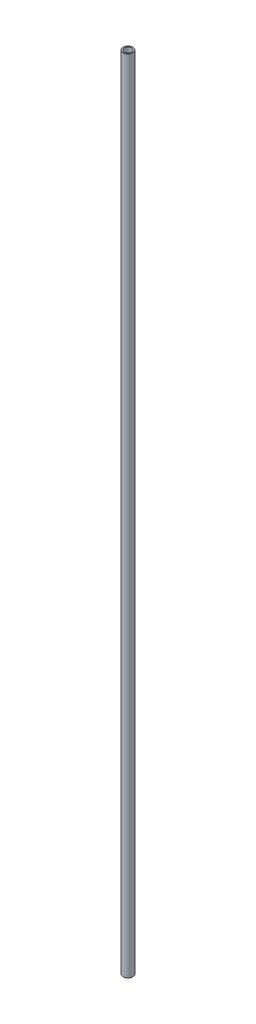
ISO-10303-21;
HEADER;
FILE_DESCRIPTION(('STEP AP214'),'2;1');
FILE_NAME('part.step','',(''),(''),'','','');
FILE_SCHEMA(('AUTOMOTIVE_DESIGN { 1 0 10303 214 1 1 1 1 }'));
ENDSEC;
DATA;
#1=APPLICATION_CONTEXT('core data for automotive mechanical design processes');
#2=APPLICATION_PROTOCOL_DEFINITION('international standard','automotive_design',2000,#1);
#3=PRODUCT_CONTEXT('',#1,'mechanical');
#4=PRODUCT('Part','Part','',(#3));
#5=PRODUCT_RELATED_PRODUCT_CATEGORY('part','',(#4));
#6=PRODUCT_DEFINITION_FORMATION('','',#4);
#7=PRODUCT_DEFINITION_CONTEXT('part definition',#1,'design');
#8=PRODUCT_DEFINITION('design','',#6,#7);
#9=PRODUCT_DEFINITION_SHAPE('','',#8);
#10=(LENGTH_UNIT() NAMED_UNIT(*) SI_UNIT(.MILLI.,.METRE.));
#11=(NAMED_UNIT(*) PLANE_ANGLE_UNIT() SI_UNIT($,.RADIAN.));
#12=(NAMED_UNIT(*) SI_UNIT($,.STERADIAN.) SOLID_ANGLE_UNIT());
#13=UNCERTAINTY_MEASURE_WITH_UNIT(LENGTH_MEASURE(1.E-05),#10,'distance_accuracy_value','');
#14=(GEOMETRIC_REPRESENTATION_CONTEXT(3) GLOBAL_UNCERTAINTY_ASSIGNED_CONTEXT((#13)) GLOBAL_UNIT_ASSIGNED_CONTEXT((#10,
#11,#12)) REPRESENTATION_CONTEXT('',''));
#15=CARTESIAN_POINT('',(0.,0.,0.));
#16=DIRECTION('',(0.,0.,1.));
#17=DIRECTION('',(1.,0.,0.));
#18=AXIS2_PLACEMENT_3D('',#15,#16,#17);
#19=CARTESIAN_POINT('',(0.,650.,0.));
#20=DIRECTION('',(0.,1.,0.));
#21=DIRECTION('',(0.,0.,1.));
#22=AXIS2_PLACEMENT_3D('',#19,#20,#21);
#23=PLANE('',#22);
#24=CARTESIAN_POINT('',(0.,650.,0.));
#25=DIRECTION('',(0.,1.,0.));
#26=DIRECTION('',(0.,0.,1.));
#27=AXIS2_PLACEMENT_3D('',#24,#25,#26);
#28=CIRCLE('',#27,4.);
#29=CARTESIAN_POINT('',(0.,650.,4.00000000000001));
#30=VERTEX_POINT('',#29);
#31=EDGE_CURVE('E10',#30,#30,#28,.T.);
#32=ORIENTED_EDGE('',*,*,#31,.T.);
#33=EDGE_LOOP('',(#32));
#34=FACE_BOUND('',#33,.T.);
#35=CARTESIAN_POINT('',(0.,650.,0.));
#36=DIRECTION('',(0.,1.,0.));
#37=DIRECTION('',(0.,0.,1.));
#38=AXIS2_PLACEMENT_3D('',#35,#36,#37);
#39=CIRCLE('',#38,3.);
#40=CARTESIAN_POINT('',(0.,650.,3.00000000000001));
#41=VERTEX_POINT('',#40);
#42=EDGE_CURVE('E53',#41,#41,#39,.T.);
#43=ORIENTED_EDGE('',*,*,#42,.F.);
#44=EDGE_LOOP('',(#43));
#45=FACE_BOUND('',#44,.T.);
#46=ADVANCED_FACE('F39',(#34,#45),#23,.T.);
#47=CARTESIAN_POINT('',(0.,0.,0.));
#48=DIRECTION('',(0.,1.,0.));
#49=DIRECTION('',(0.,0.,1.));
#50=AXIS2_PLACEMENT_3D('',#47,#48,#49);
#51=PLANE('',#50);
#52=CARTESIAN_POINT('',(0.,0.,0.));
#53=DIRECTION('',(0.,1.,0.));
#54=DIRECTION('',(0.,0.,1.));
#55=AXIS2_PLACEMENT_3D('',#52,#53,#54);
#56=CIRCLE('',#55,4.);
#57=CARTESIAN_POINT('',(0.,0.,4.00000000000001));
#58=VERTEX_POINT('',#57);
#59=EDGE_CURVE('E43',#58,#58,#56,.T.);
#60=ORIENTED_EDGE('',*,*,#59,.F.);
#61=EDGE_LOOP('',(#60));
#62=FACE_BOUND('',#61,.T.);
#63=CARTESIAN_POINT('',(0.,0.,0.));
#64=DIRECTION('',(0.,1.,0.));
#65=DIRECTION('',(0.,0.,1.));
#66=AXIS2_PLACEMENT_3D('',#63,#64,#65);
#67=CIRCLE('',#66,3.);
#68=CARTESIAN_POINT('',(0.,0.,3.00000000000001));
#69=VERTEX_POINT('',#68);
#70=EDGE_CURVE('E55',#69,#69,#67,.T.);
#71=ORIENTED_EDGE('',*,*,#70,.T.);
#72=EDGE_LOOP('',(#71));
#73=FACE_BOUND('',#72,.T.);
#74=ADVANCED_FACE('F68',(#62,#73),#51,.F.);
#75=CARTESIAN_POINT('',(0.,650.,0.));
#76=DIRECTION('',(0.,-1.,0.));
#77=DIRECTION('',(0.,0.,-1.));
#78=AXIS2_PLACEMENT_3D('',#75,#76,#77);
#79=CYLINDRICAL_SURFACE('',#78,4.);
#80=ORIENTED_EDGE('',*,*,#31,.F.);
#81=EDGE_LOOP('',(#80));
#82=FACE_BOUND('',#81,.T.);
#83=ORIENTED_EDGE('',*,*,#59,.T.);
#84=EDGE_LOOP('',(#83));
#85=FACE_BOUND('',#84,.T.);
#86=ADVANCED_FACE('F41',(#82,#85),#79,.T.);
#87=CARTESIAN_POINT('',(0.,650.,0.));
#88=DIRECTION('',(0.,-1.,0.));
#89=DIRECTION('',(0.,0.,-1.));
#90=AXIS2_PLACEMENT_3D('',#87,#88,#89);
#91=CYLINDRICAL_SURFACE('',#90,3.);
#92=ORIENTED_EDGE('',*,*,#42,.T.);
#93=EDGE_LOOP('',(#92));
#94=FACE_BOUND('',#93,.T.);
#95=ORIENTED_EDGE('',*,*,#70,.F.);
#96=EDGE_LOOP('',(#95));
#97=FACE_BOUND('',#96,.T.);
#98=ADVANCED_FACE('F64',(#94,#97),#91,.F.);
#99=CLOSED_SHELL('',(#46,#74,#86,#98));
#100=MANIFOLD_SOLID_BREP('B2',#99);
#101=ADVANCED_BREP_SHAPE_REPRESENTATION('',(#18,#100),#14);
#102=SHAPE_DEFINITION_REPRESENTATION(#9,#101);
ENDSEC;
END-ISO-10303-21;
